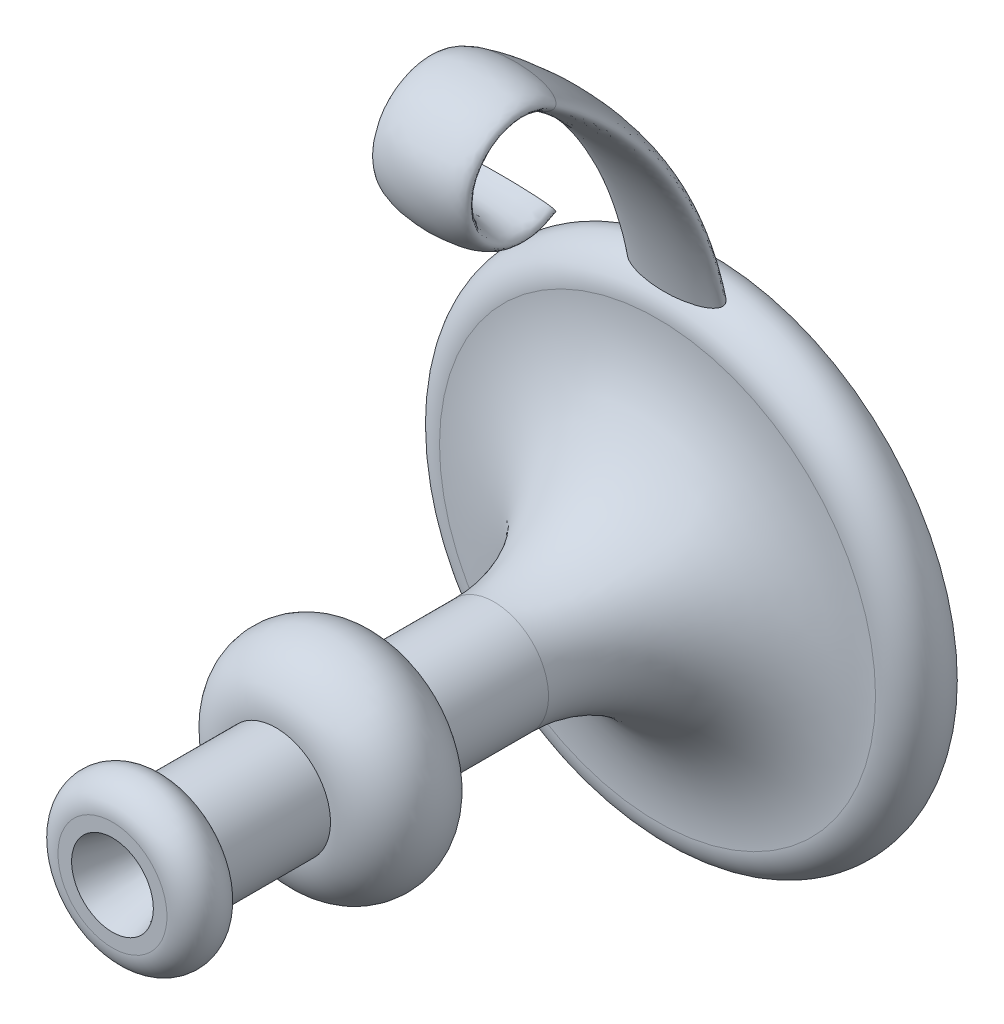
ISO-10303-21;
HEADER;
FILE_DESCRIPTION(('STEP AP214'),'2;1');
FILE_NAME('part.step','',(''),(''),'','','');
FILE_SCHEMA(('AUTOMOTIVE_DESIGN { 1 0 10303 214 1 1 1 1 }'));
ENDSEC;
DATA;
#1=APPLICATION_CONTEXT('core data for automotive mechanical design processes');
#2=APPLICATION_PROTOCOL_DEFINITION('international standard','automotive_design',2000,#1);
#3=PRODUCT_CONTEXT('',#1,'mechanical');
#4=PRODUCT('Part','Part','',(#3));
#5=PRODUCT_RELATED_PRODUCT_CATEGORY('part','',(#4));
#6=PRODUCT_DEFINITION_FORMATION('','',#4);
#7=PRODUCT_DEFINITION_CONTEXT('part definition',#1,'design');
#8=PRODUCT_DEFINITION('design','',#6,#7);
#9=PRODUCT_DEFINITION_SHAPE('','',#8);
#10=(LENGTH_UNIT() NAMED_UNIT(*) SI_UNIT(.MILLI.,.METRE.));
#11=(NAMED_UNIT(*) PLANE_ANGLE_UNIT() SI_UNIT($,.RADIAN.));
#12=(NAMED_UNIT(*) SI_UNIT($,.STERADIAN.) SOLID_ANGLE_UNIT());
#13=UNCERTAINTY_MEASURE_WITH_UNIT(LENGTH_MEASURE(1.E-05),#10,'distance_accuracy_value','');
#14=(GEOMETRIC_REPRESENTATION_CONTEXT(3) GLOBAL_UNCERTAINTY_ASSIGNED_CONTEXT((#13)) GLOBAL_UNIT_ASSIGNED_CONTEXT((#10,
#11,#12)) REPRESENTATION_CONTEXT('',''));
#15=CARTESIAN_POINT('',(0.,0.,0.));
#16=DIRECTION('',(0.,0.,1.));
#17=DIRECTION('',(1.,0.,0.));
#18=AXIS2_PLACEMENT_3D('',#15,#16,#17);
#19=CARTESIAN_POINT('',(0.,0.,0.));
#20=DIRECTION('',(0.,0.,-1.));
#21=DIRECTION('',(-1.,0.,0.));
#22=AXIS2_PLACEMENT_3D('',#19,#20,#21);
#23=PLANE('',#22);
#24=CARTESIAN_POINT('',(0.,0.,0.));
#25=DIRECTION('',(0.,0.,-1.));
#26=DIRECTION('',(-1.,0.,0.));
#27=AXIS2_PLACEMENT_3D('',#24,#25,#26);
#28=CIRCLE('',#27,90.);
#29=CARTESIAN_POINT('',(-90.,0.,0.));
#30=VERTEX_POINT('',#29);
#31=EDGE_CURVE('E67',#30,#30,#28,.T.);
#32=ORIENTED_EDGE('',*,*,#31,.T.);
#33=EDGE_LOOP('',(#32));
#34=FACE_BOUND('',#33,.T.);
#35=ADVANCED_FACE('F40',(#34),#23,.T.);
#36=CARTESIAN_POINT('',(0.,0.,220.));
#37=DIRECTION('',(0.,0.,1.));
#38=DIRECTION('',(1.,0.,0.));
#39=AXIS2_PLACEMENT_3D('',#36,#37,#38);
#40=PLANE('',#39);
#41=CARTESIAN_POINT('',(0.,0.,220.));
#42=DIRECTION('',(0.,0.,1.));
#43=DIRECTION('',(1.,0.,0.));
#44=AXIS2_PLACEMENT_3D('',#41,#42,#43);
#45=CIRCLE('',#44,15.);
#46=CARTESIAN_POINT('',(15.,0.,220.));
#47=VERTEX_POINT('',#46);
#48=EDGE_CURVE('E81',#47,#47,#45,.T.);
#49=ORIENTED_EDGE('',*,*,#48,.F.);
#50=EDGE_LOOP('',(#49));
#51=FACE_BOUND('',#50,.T.);
#52=CARTESIAN_POINT('',(0.,0.,220.));
#53=DIRECTION('',(0.,0.,-1.));
#54=DIRECTION('',(-1.,0.,0.));
#55=AXIS2_PLACEMENT_3D('',#52,#53,#54);
#56=CIRCLE('',#55,20.);
#57=CARTESIAN_POINT('',(-20.,0.,220.));
#58=VERTEX_POINT('',#57);
#59=EDGE_CURVE('E48',#58,#58,#56,.T.);
#60=ORIENTED_EDGE('',*,*,#59,.F.);
#61=EDGE_LOOP('',(#60));
#62=FACE_BOUND('',#61,.T.);
#63=ADVANCED_FACE('F86',(#51,#62),#40,.T.);
#64=CARTESIAN_POINT('',(0.,0.,210.));
#65=DIRECTION('',(0.,0.,-1.));
#66=DIRECTION('',(-1.,0.,0.));
#67=AXIS2_PLACEMENT_3D('',#64,#65,#66);
#68=TOROIDAL_SURFACE('',#67,20.,10.);
#69=ORIENTED_EDGE('',*,*,#59,.T.);
#70=EDGE_LOOP('',(#69));
#71=FACE_BOUND('',#70,.T.);
#72=CARTESIAN_POINT('',(0.,0.,200.));
#73=DIRECTION('',(0.,0.,-1.));
#74=DIRECTION('',(-1.,0.,0.));
#75=AXIS2_PLACEMENT_3D('',#72,#73,#74);
#76=CIRCLE('',#75,20.);
#77=CARTESIAN_POINT('',(-20.,0.,200.));
#78=VERTEX_POINT('',#77);
#79=EDGE_CURVE('E55',#78,#78,#76,.T.);
#80=ORIENTED_EDGE('',*,*,#79,.F.);
#81=EDGE_LOOP('',(#80));
#82=FACE_BOUND('',#81,.T.);
#83=ADVANCED_FACE('F93',(#71,#82),#68,.T.);
#84=CARTESIAN_POINT('',(0.,0.,0.));
#85=DIRECTION('',(0.,0.,-1.));
#86=DIRECTION('',(-1.,0.,0.));
#87=AXIS2_PLACEMENT_3D('',#84,#85,#86);
#88=CYLINDRICAL_SURFACE('',#87,20.);
#89=ORIENTED_EDGE('',*,*,#79,.T.);
#90=EDGE_LOOP('',(#89));
#91=FACE_BOUND('',#90,.T.);
#92=CARTESIAN_POINT('',(0.,0.,160.));
#93=DIRECTION('',(0.,0.,-1.));
#94=DIRECTION('',(-1.,0.,0.));
#95=AXIS2_PLACEMENT_3D('',#92,#93,#94);
#96=CIRCLE('',#95,20.);
#97=CARTESIAN_POINT('',(-20.,0.,160.));
#98=VERTEX_POINT('',#97);
#99=EDGE_CURVE('E57',#98,#98,#96,.T.);
#100=ORIENTED_EDGE('',*,*,#99,.F.);
#101=EDGE_LOOP('',(#100));
#102=FACE_BOUND('',#101,.T.);
#103=ADVANCED_FACE('F100',(#91,#102),#88,.T.);
#104=CARTESIAN_POINT('',(0.,0.,140.));
#105=DIRECTION('',(0.,0.,-1.));
#106=DIRECTION('',(-1.,0.,0.));
#107=AXIS2_PLACEMENT_3D('',#104,#105,#106);
#108=TOROIDAL_SURFACE('',#107,20.,20.);
#109=ORIENTED_EDGE('',*,*,#99,.T.);
#110=EDGE_LOOP('',(#109));
#111=FACE_BOUND('',#110,.T.);
#112=CARTESIAN_POINT('',(0.,0.,120.));
#113=DIRECTION('',(0.,0.,-1.));
#114=DIRECTION('',(-1.,0.,0.));
#115=AXIS2_PLACEMENT_3D('',#112,#113,#114);
#116=CIRCLE('',#115,20.);
#117=CARTESIAN_POINT('',(-20.,0.,120.));
#118=VERTEX_POINT('',#117);
#119=EDGE_CURVE('E62',#118,#118,#116,.T.);
#120=ORIENTED_EDGE('',*,*,#119,.F.);
#121=EDGE_LOOP('',(#120));
#122=FACE_BOUND('',#121,.T.);
#123=ADVANCED_FACE('F102',(#111,#122),#108,.T.);
#124=CARTESIAN_POINT('',(0.,0.,0.));
#125=DIRECTION('',(0.,0.,-1.));
#126=DIRECTION('',(-1.,0.,0.));
#127=AXIS2_PLACEMENT_3D('',#124,#125,#126);
#128=CYLINDRICAL_SURFACE('',#127,20.);
#129=ORIENTED_EDGE('',*,*,#119,.T.);
#130=EDGE_LOOP('',(#129));
#131=FACE_BOUND('',#130,.T.);
#132=CARTESIAN_POINT('',(0.,0.,80.));
#133=DIRECTION('',(0.,0.,-1.));
#134=DIRECTION('',(-1.,0.,0.));
#135=AXIS2_PLACEMENT_3D('',#132,#133,#134);
#136=CIRCLE('',#135,20.);
#137=CARTESIAN_POINT('',(-20.,0.,80.));
#138=VERTEX_POINT('',#137);
#139=EDGE_CURVE('E61',#138,#138,#136,.T.);
#140=ORIENTED_EDGE('',*,*,#139,.F.);
#141=EDGE_LOOP('',(#140));
#142=FACE_BOUND('',#141,.T.);
#143=ADVANCED_FACE('F107',(#131,#142),#128,.T.);
#144=CARTESIAN_POINT('',(0.,0.,80.));
#145=DIRECTION('',(0.,0.,-1.));
#146=DIRECTION('',(-1.,0.,0.));
#147=AXIS2_PLACEMENT_3D('',#144,#145,#146);
#148=TOROIDAL_SURFACE('',#147,80.,60.);
#149=ORIENTED_EDGE('',*,*,#139,.T.);
#150=EDGE_LOOP('',(#149));
#151=FACE_BOUND('',#150,.T.);
#152=CARTESIAN_POINT('',(0.,0.,20.));
#153=DIRECTION('',(0.,0.,-1.));
#154=DIRECTION('',(-1.,0.,0.));
#155=AXIS2_PLACEMENT_3D('',#152,#153,#154);
#156=CIRCLE('',#155,80.);
#157=CARTESIAN_POINT('',(-80.,0.,20.));
#158=VERTEX_POINT('',#157);
#159=EDGE_CURVE('E66',#158,#158,#156,.T.);
#160=ORIENTED_EDGE('',*,*,#159,.F.);
#161=EDGE_LOOP('',(#160));
#162=FACE_BOUND('',#161,.T.);
#163=ADVANCED_FACE('F115',(#151,#162),#148,.F.);
#164=CARTESIAN_POINT('',(0.,0.,7.49999999999999));
#165=DIRECTION('',(0.,0.,-1.));
#166=DIRECTION('',(-1.,0.,0.));
#167=AXIS2_PLACEMENT_3D('',#164,#165,#166);
#168=TOROIDAL_SURFACE('',#167,80.,12.5);
#169=CARTESIAN_POINT('',(17.5,89.5597422043342,12.9414346567555));
#170=CARTESIAN_POINT('',(17.5000019534777,89.5807278946485,12.8988393157081));
#171=CARTESIAN_POINT('',(17.4977816975197,89.6018125795404,12.8563039357769));
#172=CARTESIAN_POINT('',(17.489002543543,89.6440155813562,12.7716938339371));
#173=CARTESIAN_POINT('',(17.4824425050804,89.6651339056646,12.7296192360718));
#174=CARTESIAN_POINT('',(17.4565216692095,89.7283289297819,12.6045076597417));
#175=CARTESIAN_POINT('',(17.4309204730636,89.7702246464785,12.5226255894255));
#176=CARTESIAN_POINT('',(17.3563532007827,89.8644276523311,12.3407735771966));
#177=CARTESIAN_POINT('',(17.3027527423027,89.9162117483189,12.242484901666));
#178=CARTESIAN_POINT('',(17.178826321144,90.01638786814,12.0551458272008));
#179=CARTESIAN_POINT('',(17.1084587296403,90.0647710548457,11.966119226993));
#180=CARTESIAN_POINT('',(16.9652391551481,90.1524531790239,11.806984522925));
#181=CARTESIAN_POINT('',(16.8936963434586,90.1921458014335,11.7358878994478));
#182=CARTESIAN_POINT('',(16.7438969488311,90.2690886261224,11.5996259068224));
#183=CARTESIAN_POINT('',(16.665634722265,90.3063367280021,11.5344656201532));
#184=CARTESIAN_POINT('',(16.5039763875565,90.3786756485819,11.4092540815106));
#185=CARTESIAN_POINT('',(16.4205713158719,90.4137624747614,11.349212210629));
#186=CARTESIAN_POINT('',(16.2499454917114,90.4819450166471,11.2336894025402));
#187=CARTESIAN_POINT('',(16.162725848809,90.5150413047902,11.1782071523835));
#188=CARTESIAN_POINT('',(15.9728919395737,90.5839705930101,11.063725182569));
#189=CARTESIAN_POINT('',(15.8698282905888,90.6195406839562,11.0053156128849));
#190=CARTESIAN_POINT('',(15.6606649910659,90.6886668526269,10.8929143897208));
#191=CARTESIAN_POINT('',(15.5545649910506,90.7222226971281,10.8389232475745));
#192=CARTESIAN_POINT('',(15.3401290691865,90.7874864861339,10.7348751403119));
#193=CARTESIAN_POINT('',(15.2317969483068,90.8191972688173,10.6848120890841));
#194=CARTESIAN_POINT('',(15.0131968985225,90.881005962979,10.5880683385415));
#195=CARTESIAN_POINT('',(14.9029290865687,90.9111039714557,10.5413874357517));
#196=CARTESIAN_POINT('',(14.6427529331226,90.9798973633519,10.4355491517098));
#197=CARTESIAN_POINT('',(14.4922012075481,91.0180072010883,10.377593665576));
#198=CARTESIAN_POINT('',(14.1888070722871,91.0918875553169,10.2663462891692));
#199=CARTESIAN_POINT('',(14.0359643425398,91.1276577411367,10.2130550577559));
#200=CARTESIAN_POINT('',(13.7282685712582,91.1971197458645,10.1105127689612));
#201=CARTESIAN_POINT('',(13.5734134718711,91.2308091946811,10.0612662985099));
#202=CARTESIAN_POINT('',(13.2621801041721,91.2962483962877,9.96642044574802));
#203=CARTESIAN_POINT('',(13.1058017385397,91.3279980241889,9.92082129819996));
#204=CARTESIAN_POINT('',(12.6346162266686,91.4205951755327,9.788874586608));
#205=CARTESIAN_POINT('',(12.3179025042443,91.478758906098,9.70742476979597));
#206=CARTESIAN_POINT('',(11.6792188898603,91.5890957852253,9.55493826130156));
#207=CARTESIAN_POINT('',(11.3572303186111,91.6412365063819,9.4839574142591));
#208=CARTESIAN_POINT('',(10.7107316640824,91.7397682682943,9.35136221163201));
#209=CARTESIAN_POINT('',(10.3862236929835,91.7861636672356,9.2897407482325));
#210=CARTESIAN_POINT('',(9.73512886653585,91.873697660451,9.17463718318056));
#211=CARTESIAN_POINT('',(9.40854234516831,91.9148370779326,9.12115380666539));
#212=CARTESIAN_POINT('',(8.7463033991263,91.9930777751442,9.02031209920321));
#213=CARTESIAN_POINT('',(8.41061269264353,92.0300669877613,8.97311921137163));
#214=CARTESIAN_POINT('',(7.73783252743961,92.0991833927575,8.88559842477438));
#215=CARTESIAN_POINT('',(7.40074301754628,92.1313104056235,8.84527077946755));
#216=CARTESIAN_POINT('',(6.72537142355362,92.1909161961866,8.77092313439272));
#217=CARTESIAN_POINT('',(6.38708904887208,92.2183937480205,8.73690479789186));
#218=CARTESIAN_POINT('',(5.70964427774308,92.2688480816039,8.67476840304504));
#219=CARTESIAN_POINT('',(5.37048185250316,92.2918247141674,8.64665054027196));
#220=CARTESIAN_POINT('',(4.35367181244686,92.3540877228586,8.5707660463049));
#221=CARTESIAN_POINT('',(3.67498389641665,92.3868571977359,8.53128338370558));
#222=CARTESIAN_POINT('',(2.31614711504088,92.4356134743347,8.47274161832899));
#223=CARTESIAN_POINT('',(1.63599821506842,92.4515998737813,8.45368300509718));
#224=CARTESIAN_POINT('',(0.357955102332111,92.4661200478781,8.43637339284856));
#225=CARTESIAN_POINT('',(-0.239888856143515,92.4665389208555,8.43587490179709));
#226=CARTESIAN_POINT('',(-1.43536153859155,92.4546362797528,8.45006241260831));
#227=CARTESIAN_POINT('',(-2.03299021814835,92.4423128974782,8.46475064105847));
#228=CARTESIAN_POINT('',(-3.22745109478541,92.4047541650815,8.50976680779932));
#229=CARTESIAN_POINT('',(-3.82428298010725,92.3795147316879,8.54009969200439));
#230=CARTESIAN_POINT('',(-5.01694606233266,92.3157217367252,8.61743320229678));
#231=CARTESIAN_POINT('',(-5.61277493756138,92.2771508465328,8.66445552395922));
#232=CARTESIAN_POINT('',(-6.80153886380953,92.1861026743767,8.7767878424626));
#233=CARTESIAN_POINT('',(-7.39447462535106,92.1336290020918,8.84209309262503));
#234=CARTESIAN_POINT('',(-8.28055229820533,92.0437550848418,8.95574227206716));
#235=CARTESIAN_POINT('',(-8.57528682166748,92.0119455213755,8.99622894552018));
#236=CARTESIAN_POINT('',(-9.16346094428908,91.9444204496404,9.08291539794894));
#237=CARTESIAN_POINT('',(-9.45690059926739,91.9087051114864,9.12911492811464));
#238=CARTESIAN_POINT('',(-10.0422906036686,91.8331309715696,9.22782929334075));
#239=CARTESIAN_POINT('',(-10.3342404073471,91.7932707518513,9.28034629056389));
#240=CARTESIAN_POINT('',(-10.9161852811056,91.7091179167369,9.39245062081638));
#241=CARTESIAN_POINT('',(-11.2061801005455,91.6648247441271,9.45203884286039));
#242=CARTESIAN_POINT('',(-11.7838191658172,91.571392572748,9.5793164533389));
#243=CARTESIAN_POINT('',(-12.0714617643076,91.5222504482681,9.64701107336935));
#244=CARTESIAN_POINT('',(-12.6430805537635,91.4186796874405,9.79172730085917));
#245=CARTESIAN_POINT('',(-12.9270606150359,91.3642572573634,9.86873798424107));
#246=CARTESIAN_POINT('',(-13.490421718147,91.2493765391173,10.0339529747882));
#247=CARTESIAN_POINT('',(-13.7698049377452,91.1889212109096,10.1221517983456));
#248=CARTESIAN_POINT('',(-14.183912504765,91.0929373870872,10.2648274882365));
#249=CARTESIAN_POINT('',(-14.3210581267391,91.060075748626,10.3140904181851));
#250=CARTESIAN_POINT('',(-14.5933763477653,90.9923938569385,10.4165511027194));
#251=CARTESIAN_POINT('',(-14.7285491237349,90.9575737807135,10.4697485018485));
#252=CARTESIAN_POINT('',(-15.0138774923682,90.8810851838775,10.5878451344081));
#253=CARTESIAN_POINT('',(-15.1636969104752,90.8391147723956,10.6533666208413));
#254=CARTESIAN_POINT('',(-15.4593295355903,90.7519625692611,10.7912189771816));
#255=CARTESIAN_POINT('',(-15.6051410149851,90.7067794219568,10.8635527258309));
#256=CARTESIAN_POINT('',(-15.8905749729624,90.6128939496974,11.0160439629677));
#257=CARTESIAN_POINT('',(-16.0302224467126,90.564208454431,11.0961646105686));
#258=CARTESIAN_POINT('',(-16.3016394850687,90.4624897667353,11.2662530107872));
#259=CARTESIAN_POINT('',(-16.4334173639363,90.4094613083908,11.3562100760681));
#260=CARTESIAN_POINT('',(-16.6553108138958,90.3114276481006,11.5255085385047));
#261=CARTESIAN_POINT('',(-16.7478644471359,90.2675273757817,11.6022608890605));
#262=CARTESIAN_POINT('',(-16.9236630994731,90.1761749534326,11.7643292238686));
#263=CARTESIAN_POINT('',(-17.0068929161981,90.1287172073378,11.849658775493));
#264=CARTESIAN_POINT('',(-17.160728121925,90.0292807633425,12.0313291797368));
#265=CARTESIAN_POINT('',(-17.2311575389091,89.9772518064337,12.1277974407354));
#266=CARTESIAN_POINT('',(-17.3212876850736,89.8965437818877,12.2800613987942));
#267=CARTESIAN_POINT('',(-17.3487242132162,89.8692277989252,12.3320164153138));
#268=CARTESIAN_POINT('',(-17.397521114568,89.8138320311431,12.4382955168479));
#269=CARTESIAN_POINT('',(-17.4188851676711,89.7857527202501,12.4926181439799));
#270=CARTESIAN_POINT('',(-17.4611772226903,89.7185869780334,12.62370480056));
#271=CARTESIAN_POINT('',(-17.4790502108364,89.6792533408885,12.7013692224278));
#272=CARTESIAN_POINT('',(-17.4997317533413,89.6005512815563,12.8586256339486));
#273=CARTESIAN_POINT('',(-17.5025524785485,89.5611829132232,12.938216013995));
#274=CARTESIAN_POINT('',(-17.4927372657774,89.4835317885696,13.0969633423245));
#275=CARTESIAN_POINT('',(-17.48010063065,89.4452490812936,13.1761202708966));
#276=CARTESIAN_POINT('',(-17.440649407729,89.3707047667354,13.3318071774564));
#277=CARTESIAN_POINT('',(-17.4138201116179,89.334445299377,13.4083343423532));
#278=CARTESIAN_POINT('',(-17.3357126521072,89.2510611220234,13.5858554385684));
#279=CARTESIAN_POINT('',(-17.279004762084,89.205099865083,13.6849823777221));
#280=CARTESIAN_POINT('',(-17.1491670423825,89.1180744174555,13.8744276311821));
#281=CARTESIAN_POINT('',(-17.0759737821297,89.0770301058258,13.9647099356688));
#282=CARTESIAN_POINT('',(-16.9270577307038,89.003703374471,14.1271434857572));
#283=CARTESIAN_POINT('',(-16.8525208708985,88.9709541551902,14.2001945680733));
#284=CARTESIAN_POINT('',(-16.6970292692109,88.9084968426189,14.3401811690451));
#285=CARTESIAN_POINT('',(-16.6160846261891,88.8787841266133,14.4071259665771));
#286=CARTESIAN_POINT('',(-16.4490709627676,88.8217814388548,14.5359995630884));
#287=CARTESIAN_POINT('',(-16.3629857823208,88.7944998605826,14.5979109242413));
#288=CARTESIAN_POINT('',(-16.1870697873629,88.7420667437369,14.7171734064662));
#289=CARTESIAN_POINT('',(-16.0972377082948,88.7169159331092,14.7745229686603));
#290=CARTESIAN_POINT('',(-15.9140699306459,88.6682699235336,14.8855899090514));
#291=CARTESIAN_POINT('',(-15.8207148279056,88.6447869137155,14.9392804489428));
#292=CARTESIAN_POINT('',(-15.6316626961429,88.5993971939426,15.0431008843884));
#293=CARTESIAN_POINT('',(-15.535965260352,88.5774907604157,15.0932301555104));
#294=CARTESIAN_POINT('',(-15.2458062448783,88.5137514786219,15.2390285874188));
#295=CARTESIAN_POINT('',(-15.0485147207842,88.4739596847912,15.3299685477362));
#296=CARTESIAN_POINT('',(-14.6487152633382,88.3985337506613,15.5017775203628));
#297=CARTESIAN_POINT('',(-14.4462032813467,88.3629029634838,15.5826384140043));
#298=CARTESIAN_POINT('',(-14.0365764701682,88.2948356711211,15.7363066128674));
#299=CARTESIAN_POINT('',(-13.8294450545342,88.2624142295168,15.8090761199819));
#300=CARTESIAN_POINT('',(-13.4126289871751,88.200383575138,15.9473648801959));
#301=CARTESIAN_POINT('',(-13.2029472733573,88.1707714189812,16.0128917338225));
#302=CARTESIAN_POINT('',(-12.781494994629,88.1139049361936,16.1377375745624));
#303=CARTESIAN_POINT('',(-12.5697249473616,88.0866500408507,16.1970580597507));
#304=CARTESIAN_POINT('',(-12.0912931700765,88.0276172572028,16.3244235662308));
#305=CARTESIAN_POINT('',(-11.824154050233,87.9964138193042,16.3909381265498));
#306=CARTESIAN_POINT('',(-11.2878278414634,87.9367717636615,16.5165936764723));
#307=CARTESIAN_POINT('',(-11.0186405549257,87.908333416442,16.5757339447664));
#308=CARTESIAN_POINT('',(-10.4785408424865,87.853926628297,16.687509894896));
#309=CARTESIAN_POINT('',(-10.2076276543174,87.8279593730485,16.7401424577998));
#310=CARTESIAN_POINT('',(-9.66451167999626,87.778318430933,16.839530152294));
#311=CARTESIAN_POINT('',(-9.39230883453715,87.7546448506394,16.8862850108121));
#312=CARTESIAN_POINT('',(-8.5757896592156,87.6869994555323,17.0182803050951));
#313=CARTESIAN_POINT('',(-8.02991167225212,87.6462388525845,17.095585400369));
#314=CARTESIAN_POINT('',(-6.93552385093732,87.572806551561,17.2320145687305));
#315=CARTESIAN_POINT('',(-6.38701462497807,87.5401330675681,17.291142656633));
#316=CARTESIAN_POINT('',(-5.28955884850596,87.482844195297,17.3930876120977));
#317=CARTESIAN_POINT('',(-4.74061740412236,87.458207458868,17.4359477429325));
#318=CARTESIAN_POINT('',(-3.64146108218401,87.4169410999171,17.5068884934703));
#319=CARTESIAN_POINT('',(-3.09124613761481,87.4003119088601,17.5349683167841));
#320=CARTESIAN_POINT('',(-1.98980868968888,87.3751699481989,17.5771566462026));
#321=CARTESIAN_POINT('',(-1.43858580771789,87.3666614689743,17.5912577671532));
#322=CARTESIAN_POINT('',(-0.335909067642,87.3578539704596,17.6058511840596));
#323=CARTESIAN_POINT('',(0.215544784628738,87.3575547550007,17.6063438052041));
#324=CARTESIAN_POINT('',(1.31815822776605,87.3651677510509,17.5937352162512));
#325=CARTESIAN_POINT('',(1.86931785045465,87.3730787250644,17.5806360547995));
#326=CARTESIAN_POINT('',(2.97097544678116,87.3970372477743,17.5404868292744));
#327=CARTESIAN_POINT('',(3.5214733979514,87.4130850653539,17.5134363041758));
#328=CARTESIAN_POINT('',(4.62112135667214,87.4531996813083,17.4446213827572));
#329=CARTESIAN_POINT('',(5.17027166874576,87.4772644593794,17.4028606933016));
#330=CARTESIAN_POINT('',(6.26670053623986,87.5333316774063,17.3033707612726));
#331=CARTESIAN_POINT('',(6.81397924959846,87.5653334299484,17.245642901551));
#332=CARTESIAN_POINT('',(7.65503321384225,87.6208220531234,17.1429049509078));
#333=CARTESIAN_POINT('',(7.9497802880934,87.6414679669263,17.1042333246734));
#334=CARTESIAN_POINT('',(8.53829462762654,87.685164959346,17.0212250701547));
#335=CARTESIAN_POINT('',(8.83206192120318,87.7082159678754,16.976888606942));
#336=CARTESIAN_POINT('',(9.41827197237286,87.7568106691341,16.8820510369672));
#337=CARTESIAN_POINT('',(9.71071522165222,87.7823533406005,16.8315524537738));
#338=CARTESIAN_POINT('',(10.2940938312787,87.8360989952269,16.7237193681042));
#339=CARTESIAN_POINT('',(10.5850292408512,87.8643018909561,16.6663850902734));
#340=CARTESIAN_POINT('',(11.0784529887258,87.9147712499551,16.5622842610497));
#341=CARTESIAN_POINT('',(11.2814293835368,87.9362980252958,16.5174691899782));
#342=CARTESIAN_POINT('',(11.6862455623107,87.9809118301307,16.4236835134744));
#343=CARTESIAN_POINT('',(11.8880853805222,88.0039988123357,16.3747130339796));
#344=CARTESIAN_POINT('',(12.2905621648872,88.0519198244946,16.2721215384752));
#345=CARTESIAN_POINT('',(12.4911979528441,88.0767553337327,16.2184965755422));
#346=CARTESIAN_POINT('',(12.8907612736863,88.1283787004671,16.1060707847332));
#347=CARTESIAN_POINT('',(13.0896888629044,88.1551664933027,16.0472701282657));
#348=CARTESIAN_POINT('',(13.4854201231433,88.2109999780508,15.9237718205569));
#349=CARTESIAN_POINT('',(13.6822235567032,88.2400459194862,15.8590735174957));
#350=CARTESIAN_POINT('',(14.0730419872918,88.3008027999436,15.7228691935844));
#351=CARTESIAN_POINT('',(14.2670572552422,88.3325134779588,15.6513638393836));
#352=CARTESIAN_POINT('',(14.6511973591158,88.3991424541964,15.500394811585));
#353=CARTESIAN_POINT('',(14.8413258930681,88.434057511582,15.4209391715417));
#354=CARTESIAN_POINT('',(15.2164401400189,88.5079196083053,15.2523848762556));
#355=CARTESIAN_POINT('',(15.401428146851,88.5468648114134,15.163290611764));
#356=CARTESIAN_POINT('',(15.6733114229661,88.6092096238855,15.020657971886));
#357=CARTESIAN_POINT('',(15.7630166800387,88.6306485895105,14.9716086740016));
#358=CARTESIAN_POINT('',(15.9401002079387,88.6750422753316,14.8701248615213));
#359=CARTESIAN_POINT('',(16.0274788777611,88.69799673325,14.8176909327191));
#360=CARTESIAN_POINT('',(16.1993887567143,88.7456840101802,14.7089478844267));
#361=CARTESIAN_POINT('',(16.2839180892552,88.7704179688273,14.6526362825886));
#362=CARTESIAN_POINT('',(16.449239122476,88.8219484857481,14.53564226179));
#363=CARTESIAN_POINT('',(16.5300317386036,88.8487445345049,14.474960922774));
#364=CARTESIAN_POINT('',(16.6667168433054,88.8976102788189,14.3647434848945));
#365=CARTESIAN_POINT('',(16.723695533495,88.9191374191612,14.3163230322076));
#366=CARTESIAN_POINT('',(16.8342912802678,88.9637080676471,14.2164452982154));
#367=CARTESIAN_POINT('',(16.8879075056821,88.9867519478516,14.1649872721058));
#368=CARTESIAN_POINT('',(17.042331084656,89.0583610181503,14.0058008216792));
#369=CARTESIAN_POINT('',(17.1370796109729,89.1095289234106,13.8929758416951));
#370=CARTESIAN_POINT('',(17.2707956184668,89.1999001554577,13.6963386208968));
#371=CARTESIAN_POINT('',(17.3175503480633,89.2367505169325,13.6167644879676));
#372=CARTESIAN_POINT('',(17.3968468737188,89.3136877653853,13.4522974166005));
#373=CARTESIAN_POINT('',(17.4294220837183,89.3537667767869,13.3674175273959));
#374=CARTESIAN_POINT('',(17.4685967336684,89.4217091217896,13.2251848973537));
#375=CARTESIAN_POINT('',(17.4803204652977,89.4488093840982,13.1688551716172));
#376=CARTESIAN_POINT('',(17.4960211898048,89.503794774035,13.0554594934969));
#377=CARTESIAN_POINT('',(17.499997387795,89.5316799819,12.998393466174));
#378=CARTESIAN_POINT('',(17.5,89.5597422043342,12.9414346567555));
#379=B_SPLINE_CURVE_WITH_KNOTS('',3,(#169,#170,#171,#172,#173,#174,#175,#176,#177,#178,#179,
#180,#181,#182,#183,#184,#185,#186,#187,#188,#189,#190,#191,#192,#193,#194,#195,#196,#197,#198,
#199,#200,#201,#202,#203,#204,#205,#206,#207,#208,#209,#210,#211,#212,#213,#214,#215,#216,#217,
#218,#219,#220,#221,#222,#223,#224,#225,#226,#227,#228,#229,#230,#231,#232,#233,#234,#235,#236,
#237,#238,#239,#240,#241,#242,#243,#244,#245,#246,#247,#248,#249,#250,#251,#252,#253,#254,#255,
#256,#257,#258,#259,#260,#261,#262,#263,#264,#265,#266,#267,#268,#269,#270,#271,#272,#273,#274,
#275,#276,#277,#278,#279,#280,#281,#282,#283,#284,#285,#286,#287,#288,#289,#290,#291,#292,#293,
#294,#295,#296,#297,#298,#299,#300,#301,#302,#303,#304,#305,#306,#307,#308,#309,#310,#311,#312,
#313,#314,#315,#316,#317,#318,#319,#320,#321,#322,#323,#324,#325,#326,#327,#328,#329,#330,#331,
#332,#333,#334,#335,#336,#337,#338,#339,#340,#341,#342,#343,#344,#345,#346,#347,#348,#349,#350,
#351,#352,#353,#354,#355,#356,#357,#358,#359,#360,#361,#362,#363,#364,#365,#366,#367,#368,#369,
#370,#371,#372,#373,#374,#375,#376,#377,#378),.UNSPECIFIED.,.T.,.F.,(4,2,2,2,2,2,2,2,2,2,2,2,2,
2,2,2,2,2,2,2,2,2,2,2,2,2,2,2,2,2,2,2,2,2,2,2,2,2,2,2,2,2,2,2,2,2,2,2,2,2,2,2,2,2,2,2,2,2,2,2,2,
2,2,2,2,2,2,2,2,2,2,2,2,2,2,2,2,2,2,2,2,2,2,2,2,2,2,2,2,2,2,2,2,2,2,2,2,2,2,2,2,2,2,2,4),(0.,
0.142381357158825,0.284800145338802,0.569778369710393,0.937790990160507,1.30672699797602,
1.63143353328551,1.95641550824169,2.28198085179473,2.60745211744526,2.97835758825743,
3.34930592253138,3.71966767593569,4.09000712931058,4.5871712702577,5.08440552627596,
5.58219609730412,6.08001868322195,7.07612740491138,8.07737111401404,9.07785060328463,
10.0781732018628,11.1010679437461,12.1240004418367,13.1472022244405,14.1704379160041,
16.2117115539472,18.2530341182271,20.0462457692418,21.839720367684,23.6337623045227,
25.4301450150666,27.2260617741976,28.1235892294179,29.0210776087006,29.918874033385,
30.8167834514325,31.7152755049925,32.6127240115722,33.5097343419008,33.957824727082,
34.4058746792334,34.9121604747941,35.4186611861171,35.9228725276492,36.4265413835617,
36.8100240505594,37.1941231504199,37.5831580539593,37.7772586450042,37.971241359917,
38.2366258142319,38.5017956533801,38.7669774525071,39.0324346081149,39.399655598355,
39.7683144393123,40.0959866375242,40.4231523204131,40.7514069982216,41.0797733710081,
41.4103344436383,41.7409533344658,42.4030339566277,43.065644483574,43.7312306850961,
44.3961116446166,45.0608317450516,45.8918608553092,46.7229711882516,47.5544783139774,
48.3860240564169,50.0440426041198,51.7016946763037,53.3549069476214,55.0082082878483,
56.6623826267369,58.3165174374216,59.9704029618962,61.6243431428246,63.2778668395681,
64.9312473761718,65.8251617717453,66.7190501248736,67.612573625425,68.5060677696873,
69.13295463307,69.7598225042324,70.3872272415119,71.0146112082238,71.6420645989538,
72.2694566030682,72.8962209263473,73.5227009279538,73.8360175198411,74.1492800292312,
74.4627449766604,74.7761327179498,75.0094189443197,75.2427626113349,75.7080186392225,
76.0052441465119,76.3017654013247,76.4921392885521,76.6825327068868),.UNSPECIFIED.);
#380=CARTESIAN_POINT('',(17.5,89.5597422043342,12.9414346567555));
#381=VERTEX_POINT('',#380);
#382=EDGE_CURVE('E10',#381,#381,#379,.T.);
#383=ORIENTED_EDGE('',*,*,#382,.F.);
#384=EDGE_LOOP('',(#383));
#385=FACE_BOUND('',#384,.T.);
#386=ORIENTED_EDGE('',*,*,#159,.T.);
#387=EDGE_LOOP('',(#386));
#388=FACE_BOUND('',#387,.T.);
#389=ORIENTED_EDGE('',*,*,#31,.F.);
#390=EDGE_LOOP('',(#389));
#391=FACE_BOUND('',#390,.T.);
#392=ADVANCED_FACE('F113',(#385,#388,#391),#168,.T.);
#393=CARTESIAN_POINT('',(0.,150.634185358261,75.));
#394=DIRECTION('',(0.,0.566666666666667,-0.823947139620552));
#395=DIRECTION('',(0.,0.823947139620552,0.566666666666667));
#396=AXIS2_PLACEMENT_3D('',#393,#394,#395);
#397=PLANE('',#396);
#398=CARTESIAN_POINT('',(0.,150.634185358261,75.));
#399=DIRECTION('',(0.,0.566666666666667,-0.823947139620552));
#400=DIRECTION('',(1.,0.,0.));
#401=AXIS2_PLACEMENT_3D('',#398,#399,#400);
#402=ELLIPSE('',#401,17.5,4.99999999999998);
#403=CARTESIAN_POINT('',(17.5,150.634185358261,75.));
#404=VERTEX_POINT('',#403);
#405=EDGE_CURVE('E71',#404,#404,#402,.T.);
#406=ORIENTED_EDGE('',*,*,#405,.T.);
#407=EDGE_LOOP('',(#406));
#408=FACE_BOUND('',#407,.T.);
#409=ADVANCED_FACE('F118',(#408),#397,.T.);
#410=CARTESIAN_POINT('',(17.5,60.,10.));
#411=CARTESIAN_POINT('',(17.5,110.410191303973,10.));
#412=CARTESIAN_POINT('',(17.5,155.026295870831,33.4646670673665));
#413=CARTESIAN_POINT('',(17.5,183.592070943083,75.));
#414=CARTESIAN_POINT('',(17.5,60.,0.));
#415=CARTESIAN_POINT('',(17.5,113.770870724238,0.));
#416=CARTESIAN_POINT('',(17.5,161.36138226222,25.028978205191));
#417=CARTESIAN_POINT('',(17.5,191.831542339288,69.3333333333334));
#418=CARTESIAN_POINT('',(-17.5,60.,0.));
#419=CARTESIAN_POINT('',(-17.5,113.770870724238,0.));
#420=CARTESIAN_POINT('',(-17.5,161.36138226222,25.028978205191));
#421=CARTESIAN_POINT('',(-17.5,191.831542339288,69.3333333333334));
#422=CARTESIAN_POINT('',(-17.5,60.,10.));
#423=CARTESIAN_POINT('',(-17.5,110.410191303973,10.));
#424=CARTESIAN_POINT('',(-17.5,155.026295870831,33.4646670673665));
#425=CARTESIAN_POINT('',(-17.5,183.592070943083,75.));
#426=CARTESIAN_POINT('',(-17.5,60.,20.));
#427=CARTESIAN_POINT('',(-17.5,107.049511883708,20.));
#428=CARTESIAN_POINT('',(-17.5,148.691209479443,41.9003559295421));
#429=CARTESIAN_POINT('',(-17.5,175.352599546877,80.6666666666667));
#430=CARTESIAN_POINT('',(17.5,60.,20.));
#431=CARTESIAN_POINT('',(17.5,107.049511883708,20.));
#432=CARTESIAN_POINT('',(17.5,148.691209479443,41.9003559295421));
#433=CARTESIAN_POINT('',(17.5,175.352599546877,80.6666666666667));
#434=CARTESIAN_POINT('',(17.5,60.,10.));
#435=CARTESIAN_POINT('',(17.5,110.410191303973,10.));
#436=CARTESIAN_POINT('',(17.5,155.026295870831,33.4646670673665));
#437=CARTESIAN_POINT('',(17.5,183.592070943083,75.));
#438=(BOUNDED_SURFACE() B_SPLINE_SURFACE(3,3,((#410,#411,#412,#413),(#414,#415,#416,#417),(#418,
#419,#420,#421),(#422,#423,#424,#425),(#426,#427,#428,#429),(#430,#431,#432,#433),(#434,#435,
#436,#437)),.UNSPECIFIED.,.T.,.F.,.F.) B_SPLINE_SURFACE_WITH_KNOTS((4,3,4),(4,4),(0.,0.5,1.),
(0.,1.),.UNSPECIFIED.) GEOMETRIC_REPRESENTATION_ITEM() RATIONAL_B_SPLINE_SURFACE(((1.,
0.923374135437856,0.923374135437856,1.),(0.333333333333333,0.307791378479285,0.307791378479285,
0.333333333333333),(0.333333333333333,0.307791378479285,0.307791378479285,0.333333333333333),
(1.,0.923374135437856,0.923374135437856,1.),(0.333333333333333,0.307791378479285,
0.307791378479285,0.333333333333333),(0.333333333333333,0.307791378479285,0.307791378479285,
0.333333333333333),(1.,0.923374135437856,0.923374135437856,1.))) REPRESENTATION_ITEM('') SURFACE());
#439=CARTESIAN_POINT('',(0.,183.592070943083,75.));
#440=DIRECTION('',(0.,0.566666666666667,0.823947139620552));
#441=DIRECTION('',(1.,0.,0.));
#442=AXIS2_PLACEMENT_3D('',#439,#440,#441);
#443=ELLIPSE('',#442,17.5,4.99999999999998);
#444=CARTESIAN_POINT('',(17.5,183.592070943083,75.));
#445=VERTEX_POINT('',#444);
#446=EDGE_CURVE('E77',#445,#445,#443,.T.);
#447=ORIENTED_EDGE('',*,*,#382,.T.);
#448=EDGE_LOOP('',(#447));
#449=FACE_BOUND('',#448,.T.);
#450=ORIENTED_EDGE('',*,*,#446,.F.);
#451=EDGE_LOOP('',(#450));
#452=FACE_BOUND('',#451,.T.);
#453=ADVANCED_FACE('F122',(#449,#452),#438,.T.);
#454=CARTESIAN_POINT('',(17.5,183.592070943083,75.));
#455=CARTESIAN_POINT('',(17.5,193.981461744242,90.1064273523801));
#456=CARTESIAN_POINT('',(17.5,185.447347211541,106.333333333333));
#457=CARTESIAN_POINT('',(17.5,167.113128150672,106.333333333333));
#458=CARTESIAN_POINT('',(17.5,148.778909089802,106.333333333333));
#459=CARTESIAN_POINT('',(17.5,140.244794557101,90.1064273523801));
#460=CARTESIAN_POINT('',(17.5,150.634185358261,75.));
#461=CARTESIAN_POINT('',(17.5,191.831542339288,69.3333333333334));
#462=CARTESIAN_POINT('',(17.5,207.415628541027,91.9929743619034));
#463=CARTESIAN_POINT('',(17.5,194.614456741976,116.333333333333));
#464=CARTESIAN_POINT('',(17.5,167.113128150672,116.333333333333));
#465=CARTESIAN_POINT('',(17.5,139.611799559367,116.333333333333));
#466=CARTESIAN_POINT('',(17.5,126.810627760316,91.9929743619035));
#467=CARTESIAN_POINT('',(17.5,142.394713962055,69.3333333333334));
#468=CARTESIAN_POINT('',(-17.5,191.831542339288,69.3333333333334));
#469=CARTESIAN_POINT('',(-17.5,207.415628541027,91.9929743619034));
#470=CARTESIAN_POINT('',(-17.5,194.614456741976,116.333333333333));
#471=CARTESIAN_POINT('',(-17.5,167.113128150672,116.333333333333));
#472=CARTESIAN_POINT('',(-17.5,139.611799559367,116.333333333333));
#473=CARTESIAN_POINT('',(-17.5,126.810627760316,91.9929743619035));
#474=CARTESIAN_POINT('',(-17.5,142.394713962055,69.3333333333334));
#475=CARTESIAN_POINT('',(-17.5,183.592070943083,75.));
#476=CARTESIAN_POINT('',(-17.5,193.981461744242,90.1064273523801));
#477=CARTESIAN_POINT('',(-17.5,185.447347211541,106.333333333333));
#478=CARTESIAN_POINT('',(-17.5,167.113128150672,106.333333333333));
#479=CARTESIAN_POINT('',(-17.5,148.778909089802,106.333333333333));
#480=CARTESIAN_POINT('',(-17.5,140.244794557101,90.1064273523801));
#481=CARTESIAN_POINT('',(-17.5,150.634185358261,75.));
#482=CARTESIAN_POINT('',(-17.5,175.352599546877,80.6666666666667));
#483=CARTESIAN_POINT('',(-17.5,180.547294947457,88.2198803428567));
#484=CARTESIAN_POINT('',(-17.5,176.280237681106,96.3333333333334));
#485=CARTESIAN_POINT('',(-17.5,167.113128150672,96.3333333333334));
#486=CARTESIAN_POINT('',(-17.5,157.946018620237,96.3333333333333));
#487=CARTESIAN_POINT('',(-17.5,153.678961353886,88.2198803428567));
#488=CARTESIAN_POINT('',(-17.5,158.873656754466,80.6666666666666));
#489=CARTESIAN_POINT('',(17.5,175.352599546877,80.6666666666667));
#490=CARTESIAN_POINT('',(17.5,180.547294947457,88.2198803428567));
#491=CARTESIAN_POINT('',(17.5,176.280237681106,96.3333333333334));
#492=CARTESIAN_POINT('',(17.5,167.113128150672,96.3333333333334));
#493=CARTESIAN_POINT('',(17.5,157.946018620237,96.3333333333333));
#494=CARTESIAN_POINT('',(17.5,153.678961353886,88.2198803428567));
#495=CARTESIAN_POINT('',(17.5,158.873656754466,80.6666666666666));
#496=CARTESIAN_POINT('',(17.5,183.592070943083,75.));
#497=CARTESIAN_POINT('',(17.5,193.981461744242,90.1064273523801));
#498=CARTESIAN_POINT('',(17.5,185.447347211541,106.333333333333));
#499=CARTESIAN_POINT('',(17.5,167.113128150672,106.333333333333));
#500=CARTESIAN_POINT('',(17.5,148.778909089802,106.333333333333));
#501=CARTESIAN_POINT('',(17.5,140.244794557101,90.1064273523801));
#502=CARTESIAN_POINT('',(17.5,150.634185358261,75.));
#503=(BOUNDED_SURFACE() B_SPLINE_SURFACE(3,3,((#454,#455,#456,#457,#458,#459,#460),(#461,#462,
#463,#464,#465,#466,#467),(#468,#469,#470,#471,#472,#473,#474),(#475,#476,#477,#478,#479,#480,
#481),(#482,#483,#484,#485,#486,#487,#488),(#489,#490,#491,#492,#493,#494,#495),(#496,#497,#498,
#499,#500,#501,#502)),.UNSPECIFIED.,.T.,.F.,.F.) B_SPLINE_SURFACE_WITH_KNOTS((4,3,4),(4,3,4),
(0.,0.5,1.),(0.,0.5,1.),
.UNSPECIFIED.) GEOMETRIC_REPRESENTATION_ITEM() RATIONAL_B_SPLINE_SURFACE(((1.,0.643649778750421,
0.643649778750421,1.,0.643649778750421,0.643649778750421,1.),(0.333333333333333,
0.21454992625014,0.21454992625014,0.333333333333333,0.21454992625014,0.21454992625014,
0.333333333333333),(0.333333333333333,0.21454992625014,0.21454992625014,0.333333333333333,
0.21454992625014,0.21454992625014,0.333333333333333),(1.,0.643649778750421,0.643649778750421,1.,
0.643649778750421,0.643649778750421,1.),(0.333333333333333,0.21454992625014,0.21454992625014,
0.333333333333333,0.21454992625014,0.21454992625014,0.333333333333333),(0.333333333333333,
0.21454992625014,0.21454992625014,0.333333333333333,0.21454992625014,0.21454992625014,
0.333333333333333),(1.,0.643649778750421,0.643649778750421,1.,0.643649778750421,
0.643649778750421,1.))) REPRESENTATION_ITEM('') SURFACE());
#504=ORIENTED_EDGE('',*,*,#405,.F.);
#505=EDGE_LOOP('',(#504));
#506=FACE_BOUND('',#505,.T.);
#507=ORIENTED_EDGE('',*,*,#446,.T.);
#508=EDGE_LOOP('',(#507));
#509=FACE_BOUND('',#508,.T.);
#510=ADVANCED_FACE('F121',(#506,#509),#503,.T.);
#511=CARTESIAN_POINT('',(0.,0.,220.));
#512=DIRECTION('',(0.,0.,1.));
#513=DIRECTION('',(1.,0.,0.));
#514=AXIS2_PLACEMENT_3D('',#511,#512,#513);
#515=CONICAL_SURFACE('',#514,15.,0.26179938779915);
#516=CARTESIAN_POINT('',(0.,0.,195.));
#517=DIRECTION('',(0.,0.,1.));
#518=DIRECTION('',(1.,0.,0.));
#519=AXIS2_PLACEMENT_3D('',#516,#517,#518);
#520=CIRCLE('',#519,8.30127018922192);
#521=CARTESIAN_POINT('',(8.30127018922192,0.,195.));
#522=VERTEX_POINT('',#521);
#523=EDGE_CURVE('E76',#522,#522,#520,.T.);
#524=ORIENTED_EDGE('',*,*,#523,.F.);
#525=EDGE_LOOP('',(#524));
#526=FACE_BOUND('',#525,.T.);
#527=ORIENTED_EDGE('',*,*,#48,.T.);
#528=EDGE_LOOP('',(#527));
#529=FACE_BOUND('',#528,.T.);
#530=ADVANCED_FACE('F88',(#526,#529),#515,.F.);
#531=CARTESIAN_POINT('',(0.,0.,195.));
#532=DIRECTION('',(0.,0.,1.));
#533=DIRECTION('',(1.,0.,0.));
#534=AXIS2_PLACEMENT_3D('',#531,#532,#533);
#535=PLANE('',#534);
#536=ORIENTED_EDGE('',*,*,#523,.T.);
#537=EDGE_LOOP('',(#536));
#538=FACE_BOUND('',#537,.T.);
#539=ADVANCED_FACE('F148',(#538),#535,.T.);
#540=CLOSED_SHELL('',(#35,#63,#83,#103,#123,#143,#163,#392,#409,#453,#510,#530,#539));
#541=MANIFOLD_SOLID_BREP('B2',#540);
#542=ADVANCED_BREP_SHAPE_REPRESENTATION('',(#18,#541),#14);
#543=SHAPE_DEFINITION_REPRESENTATION(#9,#542);
ENDSEC;
END-ISO-10303-21;
